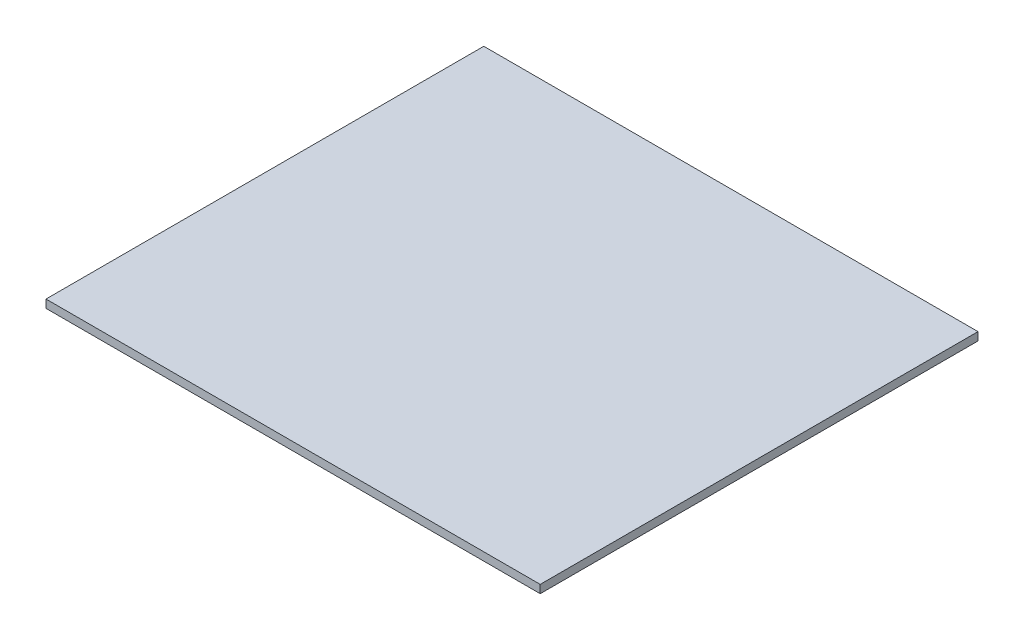
ISO-10303-21;
HEADER;
FILE_DESCRIPTION(('STEP AP214'),'2;1');
FILE_NAME('part.step','',(''),(''),'','','');
FILE_SCHEMA(('AUTOMOTIVE_DESIGN { 1 0 10303 214 1 1 1 1 }'));
ENDSEC;
DATA;
#1=APPLICATION_CONTEXT('core data for automotive mechanical design processes');
#2=APPLICATION_PROTOCOL_DEFINITION('international standard','automotive_design',2000,#1);
#3=PRODUCT_CONTEXT('',#1,'mechanical');
#4=PRODUCT('Part','Part','',(#3));
#5=PRODUCT_RELATED_PRODUCT_CATEGORY('part','',(#4));
#6=PRODUCT_DEFINITION_FORMATION('','',#4);
#7=PRODUCT_DEFINITION_CONTEXT('part definition',#1,'design');
#8=PRODUCT_DEFINITION('design','',#6,#7);
#9=PRODUCT_DEFINITION_SHAPE('','',#8);
#10=(LENGTH_UNIT() NAMED_UNIT(*) SI_UNIT(.MILLI.,.METRE.));
#11=(NAMED_UNIT(*) PLANE_ANGLE_UNIT() SI_UNIT($,.RADIAN.));
#12=(NAMED_UNIT(*) SI_UNIT($,.STERADIAN.) SOLID_ANGLE_UNIT());
#13=UNCERTAINTY_MEASURE_WITH_UNIT(LENGTH_MEASURE(1.E-05),#10,'distance_accuracy_value','');
#14=(GEOMETRIC_REPRESENTATION_CONTEXT(3) GLOBAL_UNCERTAINTY_ASSIGNED_CONTEXT((#13)) GLOBAL_UNIT_ASSIGNED_CONTEXT((#10,
#11,#12)) REPRESENTATION_CONTEXT('',''));
#15=CARTESIAN_POINT('',(0.,0.,0.));
#16=DIRECTION('',(0.,0.,1.));
#17=DIRECTION('',(1.,0.,0.));
#18=AXIS2_PLACEMENT_3D('',#15,#16,#17);
#19=CARTESIAN_POINT('',(152.4,5.,-135.));
#20=DIRECTION('',(-1.,0.,0.));
#21=DIRECTION('',(0.,0.,1.));
#22=AXIS2_PLACEMENT_3D('',#19,#20,#21);
#23=PLANE('',#22);
#24=DIRECTION('',(0.,0.,-1.));
#25=VECTOR('',#24,1.);
#26=CARTESIAN_POINT('',(152.4,0.,-135.));
#27=LINE('',#26,#25);
#28=CARTESIAN_POINT('',(152.4,0.,135.));
#29=VERTEX_POINT('',#28);
#30=CARTESIAN_POINT('',(152.4,0.,-135.));
#31=VERTEX_POINT('',#30);
#32=EDGE_CURVE('E96',#29,#31,#27,.T.);
#33=ORIENTED_EDGE('',*,*,#32,.T.);
#34=DIRECTION('',(0.,-1.,0.));
#35=VECTOR('',#34,1.);
#36=CARTESIAN_POINT('',(152.4,5.,-135.));
#37=LINE('',#36,#35);
#38=CARTESIAN_POINT('',(152.4,5.,-135.));
#39=VERTEX_POINT('',#38);
#40=EDGE_CURVE('E11',#39,#31,#37,.T.);
#41=ORIENTED_EDGE('',*,*,#40,.F.);
#42=DIRECTION('',(0.,0.,-1.));
#43=VECTOR('',#42,1.);
#44=CARTESIAN_POINT('',(152.4,5.,-135.));
#45=LINE('',#44,#43);
#46=CARTESIAN_POINT('',(152.4,5.,135.));
#47=VERTEX_POINT('',#46);
#48=EDGE_CURVE('E84',#47,#39,#45,.T.);
#49=ORIENTED_EDGE('',*,*,#48,.F.);
#50=DIRECTION('',(0.,-1.,0.));
#51=VECTOR('',#50,1.);
#52=CARTESIAN_POINT('',(152.4,5.,135.));
#53=LINE('',#52,#51);
#54=EDGE_CURVE('E92',#47,#29,#53,.T.);
#55=ORIENTED_EDGE('',*,*,#54,.T.);
#56=EDGE_LOOP('',(#33,#41,#49,#55));
#57=FACE_BOUND('',#56,.T.);
#58=ADVANCED_FACE('F33',(#57),#23,.F.);
#59=CARTESIAN_POINT('',(-152.4,5.,-135.));
#60=DIRECTION('',(0.,0.,1.));
#61=DIRECTION('',(1.,0.,0.));
#62=AXIS2_PLACEMENT_3D('',#59,#60,#61);
#63=PLANE('',#62);
#64=DIRECTION('',(-1.,0.,0.));
#65=VECTOR('',#64,1.);
#66=CARTESIAN_POINT('',(-152.4,0.,-135.));
#67=LINE('',#66,#65);
#68=CARTESIAN_POINT('',(-152.4,0.,-135.));
#69=VERTEX_POINT('',#68);
#70=EDGE_CURVE('E88',#31,#69,#67,.T.);
#71=ORIENTED_EDGE('',*,*,#70,.T.);
#72=DIRECTION('',(0.,-1.,0.));
#73=VECTOR('',#72,1.);
#74=CARTESIAN_POINT('',(-152.4,5.,-135.));
#75=LINE('',#74,#73);
#76=CARTESIAN_POINT('',(-152.4,5.,-135.));
#77=VERTEX_POINT('',#76);
#78=EDGE_CURVE('E41',#77,#69,#75,.T.);
#79=ORIENTED_EDGE('',*,*,#78,.F.);
#80=DIRECTION('',(-1.,0.,0.));
#81=VECTOR('',#80,1.);
#82=CARTESIAN_POINT('',(-152.4,5.,-135.));
#83=LINE('',#82,#81);
#84=EDGE_CURVE('E79',#39,#77,#83,.T.);
#85=ORIENTED_EDGE('',*,*,#84,.F.);
#86=ORIENTED_EDGE('',*,*,#40,.T.);
#87=EDGE_LOOP('',(#71,#79,#85,#86));
#88=FACE_BOUND('',#87,.T.);
#89=ADVANCED_FACE('F87',(#88),#63,.F.);
#90=CARTESIAN_POINT('',(-152.4,5.,-135.));
#91=DIRECTION('',(1.,0.,0.));
#92=DIRECTION('',(0.,0.,-1.));
#93=AXIS2_PLACEMENT_3D('',#90,#91,#92);
#94=PLANE('',#93);
#95=DIRECTION('',(0.,0.,1.));
#96=VECTOR('',#95,1.);
#97=CARTESIAN_POINT('',(-152.4,0.,-135.));
#98=LINE('',#97,#96);
#99=CARTESIAN_POINT('',(-152.4,0.,135.));
#100=VERTEX_POINT('',#99);
#101=EDGE_CURVE('E66',#69,#100,#98,.T.);
#102=ORIENTED_EDGE('',*,*,#101,.T.);
#103=DIRECTION('',(0.,-1.,0.));
#104=VECTOR('',#103,1.);
#105=CARTESIAN_POINT('',(-152.4,5.,135.));
#106=LINE('',#105,#104);
#107=CARTESIAN_POINT('',(-152.4,5.,135.));
#108=VERTEX_POINT('',#107);
#109=EDGE_CURVE('E89',#108,#100,#106,.T.);
#110=ORIENTED_EDGE('',*,*,#109,.F.);
#111=DIRECTION('',(0.,0.,1.));
#112=VECTOR('',#111,1.);
#113=CARTESIAN_POINT('',(-152.4,5.,-135.));
#114=LINE('',#113,#112);
#115=EDGE_CURVE('E82',#77,#108,#114,.T.);
#116=ORIENTED_EDGE('',*,*,#115,.F.);
#117=ORIENTED_EDGE('',*,*,#78,.T.);
#118=EDGE_LOOP('',(#102,#110,#116,#117));
#119=FACE_BOUND('',#118,.T.);
#120=ADVANCED_FACE('F90',(#119),#94,.F.);
#121=CARTESIAN_POINT('',(-152.4,5.,135.));
#122=DIRECTION('',(0.,0.,-1.));
#123=DIRECTION('',(-1.,0.,0.));
#124=AXIS2_PLACEMENT_3D('',#121,#122,#123);
#125=PLANE('',#124);
#126=DIRECTION('',(1.,0.,0.));
#127=VECTOR('',#126,1.);
#128=CARTESIAN_POINT('',(-152.4,0.,135.));
#129=LINE('',#128,#127);
#130=EDGE_CURVE('E72',#100,#29,#129,.T.);
#131=ORIENTED_EDGE('',*,*,#130,.T.);
#132=ORIENTED_EDGE('',*,*,#54,.F.);
#133=DIRECTION('',(1.,0.,0.));
#134=VECTOR('',#133,1.);
#135=CARTESIAN_POINT('',(-152.4,5.,135.));
#136=LINE('',#135,#134);
#137=EDGE_CURVE('E49',#108,#47,#136,.T.);
#138=ORIENTED_EDGE('',*,*,#137,.F.);
#139=ORIENTED_EDGE('',*,*,#109,.T.);
#140=EDGE_LOOP('',(#131,#132,#138,#139));
#141=FACE_BOUND('',#140,.T.);
#142=ADVANCED_FACE('F103',(#141),#125,.F.);
#143=CARTESIAN_POINT('',(0.,5.,0.));
#144=DIRECTION('',(0.,1.,0.));
#145=DIRECTION('',(0.,0.,1.));
#146=AXIS2_PLACEMENT_3D('',#143,#144,#145);
#147=PLANE('',#146);
#148=ORIENTED_EDGE('',*,*,#48,.T.);
#149=ORIENTED_EDGE('',*,*,#84,.T.);
#150=ORIENTED_EDGE('',*,*,#115,.T.);
#151=ORIENTED_EDGE('',*,*,#137,.T.);
#152=EDGE_LOOP('',(#148,#149,#150,#151));
#153=FACE_BOUND('',#152,.T.);
#154=ADVANCED_FACE('F80',(#153),#147,.T.);
#155=CARTESIAN_POINT('',(0.,0.,0.));
#156=DIRECTION('',(0.,1.,0.));
#157=DIRECTION('',(0.,0.,1.));
#158=AXIS2_PLACEMENT_3D('',#155,#156,#157);
#159=PLANE('',#158);
#160=ORIENTED_EDGE('',*,*,#32,.F.);
#161=ORIENTED_EDGE('',*,*,#130,.F.);
#162=ORIENTED_EDGE('',*,*,#101,.F.);
#163=ORIENTED_EDGE('',*,*,#70,.F.);
#164=EDGE_LOOP('',(#160,#161,#162,#163));
#165=FACE_BOUND('',#164,.T.);
#166=ADVANCED_FACE('F106',(#165),#159,.F.);
#167=CLOSED_SHELL('',(#58,#89,#120,#142,#154,#166));
#168=MANIFOLD_SOLID_BREP('B2',#167);
#169=ADVANCED_BREP_SHAPE_REPRESENTATION('',(#18,#168),#14);
#170=SHAPE_DEFINITION_REPRESENTATION(#9,#169);
ENDSEC;
END-ISO-10303-21;
